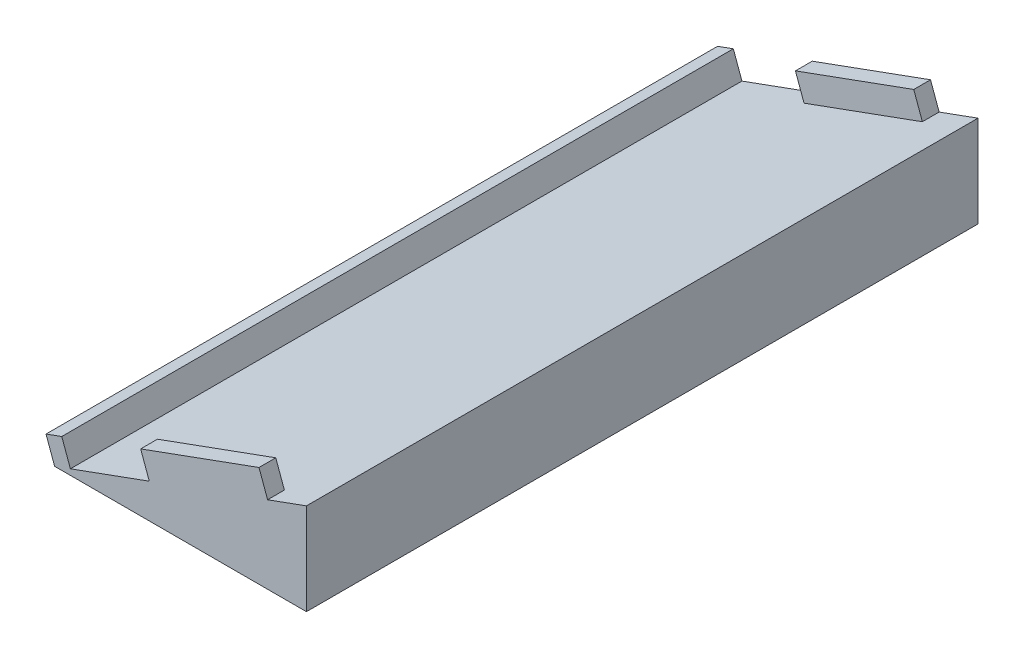
ISO-10303-21;
HEADER;
FILE_DESCRIPTION(('STEP AP214'),'2;1');
FILE_NAME('part.step','',(''),(''),'','','');
FILE_SCHEMA(('AUTOMOTIVE_DESIGN { 1 0 10303 214 1 1 1 1 }'));
ENDSEC;
DATA;
#1=APPLICATION_CONTEXT('core data for automotive mechanical design processes');
#2=APPLICATION_PROTOCOL_DEFINITION('international standard','automotive_design',2000,#1);
#3=PRODUCT_CONTEXT('',#1,'mechanical');
#4=PRODUCT('Part','Part','',(#3));
#5=PRODUCT_RELATED_PRODUCT_CATEGORY('part','',(#4));
#6=PRODUCT_DEFINITION_FORMATION('','',#4);
#7=PRODUCT_DEFINITION_CONTEXT('part definition',#1,'design');
#8=PRODUCT_DEFINITION('design','',#6,#7);
#9=PRODUCT_DEFINITION_SHAPE('','',#8);
#10=(LENGTH_UNIT() NAMED_UNIT(*) SI_UNIT(.MILLI.,.METRE.));
#11=(NAMED_UNIT(*) PLANE_ANGLE_UNIT() SI_UNIT($,.RADIAN.));
#12=(NAMED_UNIT(*) SI_UNIT($,.STERADIAN.) SOLID_ANGLE_UNIT());
#13=UNCERTAINTY_MEASURE_WITH_UNIT(LENGTH_MEASURE(1.E-05),#10,'distance_accuracy_value','');
#14=(GEOMETRIC_REPRESENTATION_CONTEXT(3) GLOBAL_UNCERTAINTY_ASSIGNED_CONTEXT((#13)) GLOBAL_UNIT_ASSIGNED_CONTEXT((#10,
#11,#12)) REPRESENTATION_CONTEXT('',''));
#15=CARTESIAN_POINT('',(0.,0.,0.));
#16=DIRECTION('',(0.,0.,1.));
#17=DIRECTION('',(1.,0.,0.));
#18=AXIS2_PLACEMENT_3D('',#15,#16,#17);
#19=CARTESIAN_POINT('',(0.,0.,80.));
#20=DIRECTION('',(0.342020143325669,-0.939692620785908,0.));
#21=DIRECTION('',(0.939692620785908,0.342020143325669,0.));
#22=AXIS2_PLACEMENT_3D('',#19,#20,#21);
#23=PLANE('',#22);
#24=DIRECTION('',(0.,0.,1.));
#25=VECTOR('',#24,1.);
#26=CARTESIAN_POINT('',(11.2763114494309,4.10424171990804,80.));
#27=LINE('',#26,#25);
#28=CARTESIAN_POINT('',(11.2763114494309,4.10424171990804,78.));
#29=VERTEX_POINT('',#28);
#30=CARTESIAN_POINT('',(11.2763114494309,4.10424171990804,80.));
#31=VERTEX_POINT('',#30);
#32=EDGE_CURVE('E55',#29,#31,#27,.T.);
#33=ORIENTED_EDGE('',*,*,#32,.F.);
#34=DIRECTION('',(-0.939692620785908,-0.342020143325669,0.));
#35=VECTOR('',#34,1.);
#36=CARTESIAN_POINT('',(11.2763114494309,4.10424171990804,78.));
#37=LINE('',#36,#35);
#38=CARTESIAN_POINT('',(25.3717007612195,9.23454386979308,78.));
#39=VERTEX_POINT('',#38);
#40=EDGE_CURVE('E160',#39,#29,#37,.T.);
#41=ORIENTED_EDGE('',*,*,#40,.F.);
#42=DIRECTION('',(0.,0.,-1.));
#43=VECTOR('',#42,1.);
#44=CARTESIAN_POINT('',(25.3717007612195,9.23454386979308,80.));
#45=LINE('',#44,#43);
#46=CARTESIAN_POINT('',(25.3717007612195,9.23454386979308,80.));
#47=VERTEX_POINT('',#46);
#48=EDGE_CURVE('E274',#47,#39,#45,.T.);
#49=ORIENTED_EDGE('',*,*,#48,.F.);
#50=DIRECTION('',(-0.939692620785908,-0.342020143325669,0.));
#51=VECTOR('',#50,1.);
#52=CARTESIAN_POINT('',(0.,0.,80.));
#53=LINE('',#52,#51);
#54=CARTESIAN_POINT('',(30.,10.9191070279861,80.));
#55=VERTEX_POINT('',#54);
#56=EDGE_CURVE('E220',#55,#47,#53,.T.);
#57=ORIENTED_EDGE('',*,*,#56,.F.);
#58=DIRECTION('',(0.,0.,-1.));
#59=VECTOR('',#58,1.);
#60=CARTESIAN_POINT('',(30.,10.9191070279861,80.));
#61=LINE('',#60,#59);
#62=CARTESIAN_POINT('',(30.,10.9191070279861,0.));
#63=VERTEX_POINT('',#62);
#64=EDGE_CURVE('E227',#55,#63,#61,.T.);
#65=ORIENTED_EDGE('',*,*,#64,.T.);
#66=DIRECTION('',(-0.939692620785908,-0.342020143325669,0.));
#67=VECTOR('',#66,1.);
#68=CARTESIAN_POINT('',(0.,0.,0.));
#69=LINE('',#68,#67);
#70=CARTESIAN_POINT('',(25.3717007612195,9.23454386979308,0.));
#71=VERTEX_POINT('',#70);
#72=EDGE_CURVE('E228',#63,#71,#69,.T.);
#73=ORIENTED_EDGE('',*,*,#72,.T.);
#74=DIRECTION('',(0.,0.,-1.));
#75=VECTOR('',#74,1.);
#76=CARTESIAN_POINT('',(25.3717007612195,9.23454386979307,0.));
#77=LINE('',#76,#75);
#78=CARTESIAN_POINT('',(25.3717007612195,9.23454386979308,2.));
#79=VERTEX_POINT('',#78);
#80=EDGE_CURVE('E175',#79,#71,#77,.T.);
#81=ORIENTED_EDGE('',*,*,#80,.F.);
#82=DIRECTION('',(0.939692620785908,0.342020143325669,0.));
#83=VECTOR('',#82,1.);
#84=CARTESIAN_POINT('',(11.2763114494309,4.10424171990803,2.));
#85=LINE('',#84,#83);
#86=CARTESIAN_POINT('',(11.2763114494309,4.10424171990803,2.));
#87=VERTEX_POINT('',#86);
#88=EDGE_CURVE('E63',#87,#79,#85,.T.);
#89=ORIENTED_EDGE('',*,*,#88,.F.);
#90=DIRECTION('',(0.,0.,1.));
#91=VECTOR('',#90,1.);
#92=CARTESIAN_POINT('',(11.2763114494309,4.10424171990803,0.));
#93=LINE('',#92,#91);
#94=CARTESIAN_POINT('',(11.2763114494309,4.10424171990803,0.));
#95=VERTEX_POINT('',#94);
#96=EDGE_CURVE('E163',#95,#87,#93,.T.);
#97=ORIENTED_EDGE('',*,*,#96,.F.);
#98=CARTESIAN_POINT('',(1.87938524157182,0.684040286651339,0.));
#99=VERTEX_POINT('',#98);
#100=EDGE_CURVE('E219',#95,#99,#69,.T.);
#101=ORIENTED_EDGE('',*,*,#100,.T.);
#102=DIRECTION('',(0.,0.,-1.));
#103=VECTOR('',#102,1.);
#104=CARTESIAN_POINT('',(1.87938524157182,0.684040286651339,0.));
#105=LINE('',#104,#103);
#106=CARTESIAN_POINT('',(1.87938524157182,0.684040286651341,80.));
#107=VERTEX_POINT('',#106);
#108=EDGE_CURVE('E195',#107,#99,#105,.T.);
#109=ORIENTED_EDGE('',*,*,#108,.F.);
#110=EDGE_CURVE('E223',#31,#107,#53,.T.);
#111=ORIENTED_EDGE('',*,*,#110,.F.);
#112=EDGE_LOOP('',(#33,#41,#49,#57,#65,#73,#81,#89,#97,#101,#109,#111));
#113=FACE_BOUND('',#112,.T.);
#114=ADVANCED_FACE('F41',(#113),#23,.F.);
#115=CARTESIAN_POINT('',(0.,0.,80.));
#116=DIRECTION('',(0.,1.,0.));
#117=DIRECTION('',(0.,0.,1.));
#118=AXIS2_PLACEMENT_3D('',#115,#116,#117);
#119=PLANE('',#118);
#120=DIRECTION('',(1.,0.,0.));
#121=VECTOR('',#120,1.);
#122=CARTESIAN_POINT('',(0.,0.,0.));
#123=LINE('',#122,#121);
#124=CARTESIAN_POINT('',(0.,0.,0.));
#125=VERTEX_POINT('',#124);
#126=CARTESIAN_POINT('',(30.,0.,0.));
#127=VERTEX_POINT('',#126);
#128=EDGE_CURVE('E230',#125,#127,#123,.T.);
#129=ORIENTED_EDGE('',*,*,#128,.T.);
#130=DIRECTION('',(0.,0.,-1.));
#131=VECTOR('',#130,1.);
#132=CARTESIAN_POINT('',(30.,0.,80.));
#133=LINE('',#132,#131);
#134=CARTESIAN_POINT('',(30.,0.,80.));
#135=VERTEX_POINT('',#134);
#136=EDGE_CURVE('E48',#135,#127,#133,.T.);
#137=ORIENTED_EDGE('',*,*,#136,.F.);
#138=DIRECTION('',(1.,0.,0.));
#139=VECTOR('',#138,1.);
#140=CARTESIAN_POINT('',(0.,0.,80.));
#141=LINE('',#140,#139);
#142=CARTESIAN_POINT('',(0.,0.,80.));
#143=VERTEX_POINT('',#142);
#144=EDGE_CURVE('E222',#143,#135,#141,.T.);
#145=ORIENTED_EDGE('',*,*,#144,.F.);
#146=DIRECTION('',(0.,0.,-1.));
#147=VECTOR('',#146,1.);
#148=CARTESIAN_POINT('',(0.,0.,80.));
#149=LINE('',#148,#147);
#150=EDGE_CURVE('E11',#143,#125,#149,.T.);
#151=ORIENTED_EDGE('',*,*,#150,.T.);
#152=EDGE_LOOP('',(#129,#137,#145,#151));
#153=FACE_BOUND('',#152,.T.);
#154=ADVANCED_FACE('F289',(#153),#119,.F.);
#155=CARTESIAN_POINT('',(30.,10.9191070279861,80.));
#156=DIRECTION('',(-1.,0.,0.));
#157=DIRECTION('',(0.,-1.,0.));
#158=AXIS2_PLACEMENT_3D('',#155,#156,#157);
#159=PLANE('',#158);
#160=DIRECTION('',(0.,1.,0.));
#161=VECTOR('',#160,1.);
#162=CARTESIAN_POINT('',(30.,10.9191070279861,0.));
#163=LINE('',#162,#161);
#164=EDGE_CURVE('E232',#127,#63,#163,.T.);
#165=ORIENTED_EDGE('',*,*,#164,.T.);
#166=ORIENTED_EDGE('',*,*,#64,.F.);
#167=DIRECTION('',(0.,1.,0.));
#168=VECTOR('',#167,1.);
#169=CARTESIAN_POINT('',(30.,10.9191070279861,80.));
#170=LINE('',#169,#168);
#171=EDGE_CURVE('E225',#135,#55,#170,.T.);
#172=ORIENTED_EDGE('',*,*,#171,.F.);
#173=ORIENTED_EDGE('',*,*,#136,.T.);
#174=EDGE_LOOP('',(#165,#166,#172,#173));
#175=FACE_BOUND('',#174,.T.);
#176=ADVANCED_FACE('F240',(#175),#159,.F.);
#177=CARTESIAN_POINT('',(0.,0.,80.));
#178=DIRECTION('',(0.,0.,-1.));
#179=DIRECTION('',(-1.,0.,0.));
#180=AXIS2_PLACEMENT_3D('',#177,#178,#179);
#181=PLANE('',#180);
#182=ORIENTED_EDGE('',*,*,#56,.T.);
#183=DIRECTION('',(0.342020143325669,-0.939692620785908,0.));
#184=VECTOR('',#183,1.);
#185=CARTESIAN_POINT('',(24.3456403312425,12.0536217321508,80.));
#186=LINE('',#185,#184);
#187=CARTESIAN_POINT('',(24.3456403312425,12.0536217321508,80.));
#188=VERTEX_POINT('',#187);
#189=EDGE_CURVE('E149',#188,#47,#186,.T.);
#190=ORIENTED_EDGE('',*,*,#189,.F.);
#191=DIRECTION('',(0.939692620785908,0.342020143325669,0.));
#192=VECTOR('',#191,1.);
#193=CARTESIAN_POINT('',(10.2502510194539,6.92331958226576,80.));
#194=LINE('',#193,#192);
#195=CARTESIAN_POINT('',(10.2502510194539,6.92331958226576,80.));
#196=VERTEX_POINT('',#195);
#197=EDGE_CURVE('E143',#196,#188,#194,.T.);
#198=ORIENTED_EDGE('',*,*,#197,.F.);
#199=DIRECTION('',(0.342020143325669,-0.939692620785908,0.));
#200=VECTOR('',#199,1.);
#201=CARTESIAN_POINT('',(10.2502510194539,6.92331958226576,80.));
#202=LINE('',#201,#200);
#203=EDGE_CURVE('E147',#196,#31,#202,.T.);
#204=ORIENTED_EDGE('',*,*,#203,.T.);
#205=ORIENTED_EDGE('',*,*,#110,.T.);
#206=DIRECTION('',(0.342020143325669,-0.939692620785908,0.));
#207=VECTOR('',#206,1.);
#208=CARTESIAN_POINT('',(0.853324811594816,3.50311814900907,80.));
#209=LINE('',#208,#207);
#210=CARTESIAN_POINT('',(0.853324811594816,3.50311814900907,80.));
#211=VERTEX_POINT('',#210);
#212=EDGE_CURVE('E213',#211,#107,#209,.T.);
#213=ORIENTED_EDGE('',*,*,#212,.F.);
#214=DIRECTION('',(0.939692620785908,0.342020143325669,0.));
#215=VECTOR('',#214,1.);
#216=CARTESIAN_POINT('',(-1.026060429977,2.81907786235773,80.));
#217=LINE('',#216,#215);
#218=CARTESIAN_POINT('',(-1.026060429977,2.81907786235773,80.));
#219=VERTEX_POINT('',#218);
#220=EDGE_CURVE('E199',#219,#211,#217,.T.);
#221=ORIENTED_EDGE('',*,*,#220,.F.);
#222=DIRECTION('',(0.342020143325669,-0.939692620785908,0.));
#223=VECTOR('',#222,1.);
#224=CARTESIAN_POINT('',(-1.026060429977,2.81907786235773,80.));
#225=LINE('',#224,#223);
#226=EDGE_CURVE('E216',#219,#143,#225,.T.);
#227=ORIENTED_EDGE('',*,*,#226,.T.);
#228=ORIENTED_EDGE('',*,*,#144,.T.);
#229=ORIENTED_EDGE('',*,*,#171,.T.);
#230=EDGE_LOOP('',(#182,#190,#198,#204,#205,#213,#221,#227,#228,#229));
#231=FACE_BOUND('',#230,.T.);
#232=ADVANCED_FACE('F146',(#231),#181,.F.);
#233=CARTESIAN_POINT('',(0.,0.,0.));
#234=DIRECTION('',(0.,0.,-1.));
#235=DIRECTION('',(-1.,0.,0.));
#236=AXIS2_PLACEMENT_3D('',#233,#234,#235);
#237=PLANE('',#236);
#238=ORIENTED_EDGE('',*,*,#72,.F.);
#239=ORIENTED_EDGE('',*,*,#164,.F.);
#240=ORIENTED_EDGE('',*,*,#128,.F.);
#241=DIRECTION('',(0.342020143325669,-0.939692620785908,0.));
#242=VECTOR('',#241,1.);
#243=CARTESIAN_POINT('',(-1.02606042997701,2.81907786235772,0.));
#244=LINE('',#243,#242);
#245=CARTESIAN_POINT('',(-1.02606042997701,2.81907786235772,0.));
#246=VERTEX_POINT('',#245);
#247=EDGE_CURVE('E205',#246,#125,#244,.T.);
#248=ORIENTED_EDGE('',*,*,#247,.F.);
#249=DIRECTION('',(-0.939692620785908,-0.342020143325669,0.));
#250=VECTOR('',#249,1.);
#251=CARTESIAN_POINT('',(-1.02606042997701,2.81907786235772,0.));
#252=LINE('',#251,#250);
#253=CARTESIAN_POINT('',(0.853324811594808,3.50311814900906,0.));
#254=VERTEX_POINT('',#253);
#255=EDGE_CURVE('E203',#254,#246,#252,.T.);
#256=ORIENTED_EDGE('',*,*,#255,.F.);
#257=DIRECTION('',(0.342020143325669,-0.939692620785908,0.));
#258=VECTOR('',#257,1.);
#259=CARTESIAN_POINT('',(0.853324811594808,3.50311814900906,0.));
#260=LINE('',#259,#258);
#261=EDGE_CURVE('E210',#254,#99,#260,.T.);
#262=ORIENTED_EDGE('',*,*,#261,.T.);
#263=ORIENTED_EDGE('',*,*,#100,.F.);
#264=DIRECTION('',(0.342020143325669,-0.939692620785908,0.));
#265=VECTOR('',#264,1.);
#266=CARTESIAN_POINT('',(10.2502510194539,6.92331958226576,0.));
#267=LINE('',#266,#265);
#268=CARTESIAN_POINT('',(10.2502510194539,6.92331958226576,0.));
#269=VERTEX_POINT('',#268);
#270=EDGE_CURVE('E180',#269,#95,#267,.T.);
#271=ORIENTED_EDGE('',*,*,#270,.F.);
#272=DIRECTION('',(-0.939692620785908,-0.342020143325669,0.));
#273=VECTOR('',#272,1.);
#274=CARTESIAN_POINT('',(10.2502510194539,6.92331958226576,0.));
#275=LINE('',#274,#273);
#276=CARTESIAN_POINT('',(24.3456403312425,12.0536217321508,0.));
#277=VERTEX_POINT('',#276);
#278=EDGE_CURVE('E179',#277,#269,#275,.T.);
#279=ORIENTED_EDGE('',*,*,#278,.F.);
#280=DIRECTION('',(0.342020143325669,-0.939692620785908,0.));
#281=VECTOR('',#280,1.);
#282=CARTESIAN_POINT('',(24.3456403312425,12.0536217321508,0.));
#283=LINE('',#282,#281);
#284=EDGE_CURVE('E187',#277,#71,#283,.T.);
#285=ORIENTED_EDGE('',*,*,#284,.T.);
#286=EDGE_LOOP('',(#238,#239,#240,#248,#256,#262,#263,#271,#279,#285));
#287=FACE_BOUND('',#286,.T.);
#288=ADVANCED_FACE('F245',(#287),#237,.T.);
#289=CARTESIAN_POINT('',(-1.02606042997701,2.81907786235772,0.));
#290=DIRECTION('',(0.939692620785908,0.342020143325669,0.));
#291=DIRECTION('',(-0.342020143325669,0.939692620785908,0.));
#292=AXIS2_PLACEMENT_3D('',#289,#290,#291);
#293=PLANE('',#292);
#294=ORIENTED_EDGE('',*,*,#150,.F.);
#295=ORIENTED_EDGE('',*,*,#226,.F.);
#296=DIRECTION('',(0.,0.,1.));
#297=VECTOR('',#296,1.);
#298=CARTESIAN_POINT('',(-1.02606042997701,2.81907786235772,0.));
#299=LINE('',#298,#297);
#300=EDGE_CURVE('E196',#246,#219,#299,.T.);
#301=ORIENTED_EDGE('',*,*,#300,.F.);
#302=ORIENTED_EDGE('',*,*,#247,.T.);
#303=EDGE_LOOP('',(#294,#295,#301,#302));
#304=FACE_BOUND('',#303,.T.);
#305=ADVANCED_FACE('F291',(#304),#293,.F.);
#306=CARTESIAN_POINT('',(0.853324811594808,3.50311814900906,0.));
#307=DIRECTION('',(-0.939692620785908,-0.342020143325669,0.));
#308=DIRECTION('',(0.342020143325669,-0.939692620785908,0.));
#309=AXIS2_PLACEMENT_3D('',#306,#307,#308);
#310=PLANE('',#309);
#311=ORIENTED_EDGE('',*,*,#108,.T.);
#312=ORIENTED_EDGE('',*,*,#261,.F.);
#313=DIRECTION('',(0.,0.,-1.));
#314=VECTOR('',#313,1.);
#315=CARTESIAN_POINT('',(0.853324811594808,3.50311814900906,0.));
#316=LINE('',#315,#314);
#317=EDGE_CURVE('E201',#211,#254,#316,.T.);
#318=ORIENTED_EDGE('',*,*,#317,.F.);
#319=ORIENTED_EDGE('',*,*,#212,.T.);
#320=EDGE_LOOP('',(#311,#312,#318,#319));
#321=FACE_BOUND('',#320,.T.);
#322=ADVANCED_FACE('F264',(#321),#310,.F.);
#323=CARTESIAN_POINT('',(-1.02606042997701,2.81907786235772,0.));
#324=DIRECTION('',(-0.342020143325669,0.939692620785908,0.));
#325=DIRECTION('',(-0.939692620785908,-0.342020143325669,0.));
#326=AXIS2_PLACEMENT_3D('',#323,#324,#325);
#327=PLANE('',#326);
#328=ORIENTED_EDGE('',*,*,#300,.T.);
#329=ORIENTED_EDGE('',*,*,#220,.T.);
#330=ORIENTED_EDGE('',*,*,#317,.T.);
#331=ORIENTED_EDGE('',*,*,#255,.T.);
#332=EDGE_LOOP('',(#328,#329,#330,#331));
#333=FACE_BOUND('',#332,.T.);
#334=ADVANCED_FACE('F270',(#333),#327,.T.);
#335=CARTESIAN_POINT('',(10.2502510194539,6.92331958226576,0.));
#336=DIRECTION('',(0.939692620785908,0.342020143325669,0.));
#337=DIRECTION('',(-0.342020143325669,0.939692620785908,0.));
#338=AXIS2_PLACEMENT_3D('',#335,#336,#337);
#339=PLANE('',#338);
#340=ORIENTED_EDGE('',*,*,#96,.T.);
#341=DIRECTION('',(0.342020143325669,-0.939692620785908,0.));
#342=VECTOR('',#341,1.);
#343=CARTESIAN_POINT('',(10.2502510194539,6.92331958226576,2.));
#344=LINE('',#343,#342);
#345=CARTESIAN_POINT('',(10.2502510194539,6.92331958226576,2.));
#346=VERTEX_POINT('',#345);
#347=EDGE_CURVE('E193',#346,#87,#344,.T.);
#348=ORIENTED_EDGE('',*,*,#347,.F.);
#349=DIRECTION('',(0.,0.,1.));
#350=VECTOR('',#349,1.);
#351=CARTESIAN_POINT('',(10.2502510194539,6.92331958226576,0.));
#352=LINE('',#351,#350);
#353=EDGE_CURVE('E171',#269,#346,#352,.T.);
#354=ORIENTED_EDGE('',*,*,#353,.F.);
#355=ORIENTED_EDGE('',*,*,#270,.T.);
#356=EDGE_LOOP('',(#340,#348,#354,#355));
#357=FACE_BOUND('',#356,.T.);
#358=ADVANCED_FACE('F259',(#357),#339,.F.);
#359=CARTESIAN_POINT('',(10.2502510194539,6.92331958226576,2.));
#360=DIRECTION('',(0.,0.,-1.));
#361=DIRECTION('',(-1.,0.,0.));
#362=AXIS2_PLACEMENT_3D('',#359,#360,#361);
#363=PLANE('',#362);
#364=ORIENTED_EDGE('',*,*,#88,.T.);
#365=DIRECTION('',(0.342020143325669,-0.939692620785908,0.));
#366=VECTOR('',#365,1.);
#367=CARTESIAN_POINT('',(24.3456403312425,12.0536217321508,2.));
#368=LINE('',#367,#366);
#369=CARTESIAN_POINT('',(24.3456403312425,12.0536217321508,2.));
#370=VERTEX_POINT('',#369);
#371=EDGE_CURVE('E190',#370,#79,#368,.T.);
#372=ORIENTED_EDGE('',*,*,#371,.F.);
#373=DIRECTION('',(0.939692620785908,0.342020143325669,0.));
#374=VECTOR('',#373,1.);
#375=CARTESIAN_POINT('',(10.2502510194539,6.92331958226576,2.));
#376=LINE('',#375,#374);
#377=EDGE_CURVE('E174',#346,#370,#376,.T.);
#378=ORIENTED_EDGE('',*,*,#377,.F.);
#379=ORIENTED_EDGE('',*,*,#347,.T.);
#380=EDGE_LOOP('',(#364,#372,#378,#379));
#381=FACE_BOUND('',#380,.T.);
#382=ADVANCED_FACE('F255',(#381),#363,.F.);
#383=CARTESIAN_POINT('',(24.3456403312425,12.0536217321508,0.));
#384=DIRECTION('',(-0.939692620785908,-0.342020143325669,0.));
#385=DIRECTION('',(0.342020143325669,-0.939692620785908,0.));
#386=AXIS2_PLACEMENT_3D('',#383,#384,#385);
#387=PLANE('',#386);
#388=ORIENTED_EDGE('',*,*,#80,.T.);
#389=ORIENTED_EDGE('',*,*,#284,.F.);
#390=DIRECTION('',(0.,0.,-1.));
#391=VECTOR('',#390,1.);
#392=CARTESIAN_POINT('',(24.3456403312425,12.0536217321508,0.));
#393=LINE('',#392,#391);
#394=EDGE_CURVE('E177',#370,#277,#393,.T.);
#395=ORIENTED_EDGE('',*,*,#394,.F.);
#396=ORIENTED_EDGE('',*,*,#371,.T.);
#397=EDGE_LOOP('',(#388,#389,#395,#396));
#398=FACE_BOUND('',#397,.T.);
#399=ADVANCED_FACE('F251',(#398),#387,.F.);
#400=CARTESIAN_POINT('',(-1.02606042997701,2.81907786235773,0.));
#401=DIRECTION('',(-0.342020143325669,0.939692620785908,0.));
#402=DIRECTION('',(-0.939692620785908,-0.342020143325669,0.));
#403=AXIS2_PLACEMENT_3D('',#400,#401,#402);
#404=PLANE('',#403);
#405=ORIENTED_EDGE('',*,*,#353,.T.);
#406=ORIENTED_EDGE('',*,*,#377,.T.);
#407=ORIENTED_EDGE('',*,*,#394,.T.);
#408=ORIENTED_EDGE('',*,*,#278,.T.);
#409=EDGE_LOOP('',(#405,#406,#407,#408));
#410=FACE_BOUND('',#409,.T.);
#411=ADVANCED_FACE('F367',(#410),#404,.T.);
#412=CARTESIAN_POINT('',(10.2502510194539,6.92331958226576,80.));
#413=DIRECTION('',(0.939692620785908,0.342020143325669,0.));
#414=DIRECTION('',(-0.342020143325669,0.939692620785908,0.));
#415=AXIS2_PLACEMENT_3D('',#412,#413,#414);
#416=PLANE('',#415);
#417=ORIENTED_EDGE('',*,*,#32,.T.);
#418=ORIENTED_EDGE('',*,*,#203,.F.);
#419=DIRECTION('',(0.,0.,1.));
#420=VECTOR('',#419,1.);
#421=CARTESIAN_POINT('',(10.2502510194539,6.92331958226576,80.));
#422=LINE('',#421,#420);
#423=CARTESIAN_POINT('',(10.2502510194539,6.92331958226576,78.));
#424=VERTEX_POINT('',#423);
#425=EDGE_CURVE('E153',#424,#196,#422,.T.);
#426=ORIENTED_EDGE('',*,*,#425,.F.);
#427=DIRECTION('',(0.342020143325669,-0.939692620785908,0.));
#428=VECTOR('',#427,1.);
#429=CARTESIAN_POINT('',(10.2502510194539,6.92331958226576,78.));
#430=LINE('',#429,#428);
#431=EDGE_CURVE('E281',#424,#29,#430,.T.);
#432=ORIENTED_EDGE('',*,*,#431,.T.);
#433=EDGE_LOOP('',(#417,#418,#426,#432));
#434=FACE_BOUND('',#433,.T.);
#435=ADVANCED_FACE('F162',(#434),#416,.F.);
#436=CARTESIAN_POINT('',(24.3456403312425,12.0536217321508,80.));
#437=DIRECTION('',(-0.939692620785908,-0.342020143325669,0.));
#438=DIRECTION('',(0.342020143325669,-0.939692620785908,0.));
#439=AXIS2_PLACEMENT_3D('',#436,#437,#438);
#440=PLANE('',#439);
#441=ORIENTED_EDGE('',*,*,#48,.T.);
#442=DIRECTION('',(0.342020143325669,-0.939692620785908,0.));
#443=VECTOR('',#442,1.);
#444=CARTESIAN_POINT('',(24.3456403312425,12.0536217321508,78.));
#445=LINE('',#444,#443);
#446=CARTESIAN_POINT('',(24.3456403312425,12.0536217321508,78.));
#447=VERTEX_POINT('',#446);
#448=EDGE_CURVE('E167',#447,#39,#445,.T.);
#449=ORIENTED_EDGE('',*,*,#448,.F.);
#450=DIRECTION('',(0.,0.,-1.));
#451=VECTOR('',#450,1.);
#452=CARTESIAN_POINT('',(24.3456403312425,12.0536217321508,80.));
#453=LINE('',#452,#451);
#454=EDGE_CURVE('E152',#188,#447,#453,.T.);
#455=ORIENTED_EDGE('',*,*,#454,.F.);
#456=ORIENTED_EDGE('',*,*,#189,.T.);
#457=EDGE_LOOP('',(#441,#449,#455,#456));
#458=FACE_BOUND('',#457,.T.);
#459=ADVANCED_FACE('F287',(#458),#440,.F.);
#460=CARTESIAN_POINT('',(10.2502510194539,6.92331958226576,78.));
#461=DIRECTION('',(0.,0.,1.));
#462=DIRECTION('',(1.,0.,0.));
#463=AXIS2_PLACEMENT_3D('',#460,#461,#462);
#464=PLANE('',#463);
#465=ORIENTED_EDGE('',*,*,#40,.T.);
#466=ORIENTED_EDGE('',*,*,#431,.F.);
#467=DIRECTION('',(-0.939692620785908,-0.342020143325669,0.));
#468=VECTOR('',#467,1.);
#469=CARTESIAN_POINT('',(10.2502510194539,6.92331958226576,78.));
#470=LINE('',#469,#468);
#471=EDGE_CURVE('E158',#447,#424,#470,.T.);
#472=ORIENTED_EDGE('',*,*,#471,.F.);
#473=ORIENTED_EDGE('',*,*,#448,.T.);
#474=EDGE_LOOP('',(#465,#466,#472,#473));
#475=FACE_BOUND('',#474,.T.);
#476=ADVANCED_FACE('F285',(#475),#464,.F.);
#477=CARTESIAN_POINT('',(-1.02606042997701,2.81907786235773,0.));
#478=DIRECTION('',(0.342020143325669,-0.939692620785908,0.));
#479=DIRECTION('',(0.939692620785908,0.342020143325669,0.));
#480=AXIS2_PLACEMENT_3D('',#477,#478,#479);
#481=PLANE('',#480);
#482=ORIENTED_EDGE('',*,*,#425,.T.);
#483=ORIENTED_EDGE('',*,*,#197,.T.);
#484=ORIENTED_EDGE('',*,*,#454,.T.);
#485=ORIENTED_EDGE('',*,*,#471,.T.);
#486=EDGE_LOOP('',(#482,#483,#484,#485));
#487=FACE_BOUND('',#486,.T.);
#488=ADVANCED_FACE('F156',(#487),#481,.F.);
#489=CLOSED_SHELL('',(#114,#154,#176,#232,#288,#305,#322,#334,#358,#382,#399,#411,#435,#459,
#476,#488));
#490=MANIFOLD_SOLID_BREP('B2',#489);
#491=ADVANCED_BREP_SHAPE_REPRESENTATION('',(#18,#490),#14);
#492=SHAPE_DEFINITION_REPRESENTATION(#9,#491);
ENDSEC;
END-ISO-10303-21;
